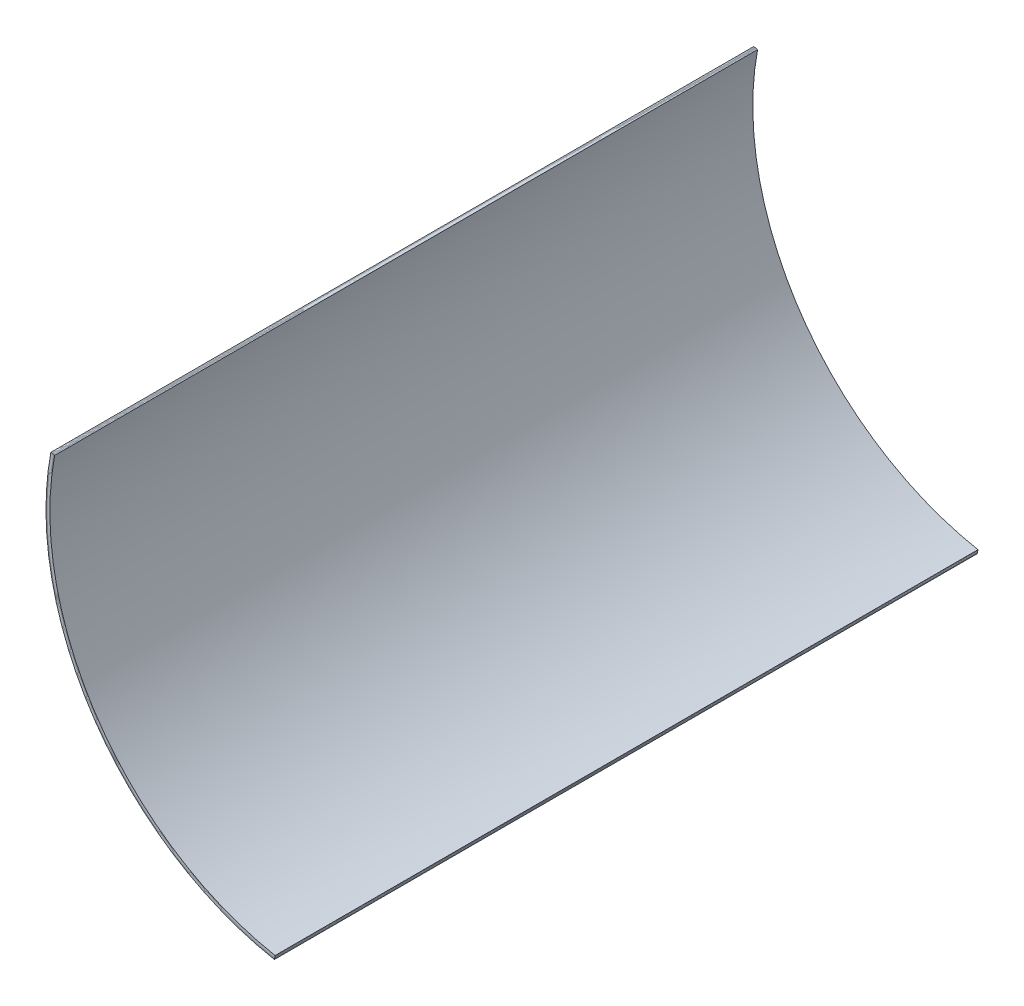
ISO-10303-21;
HEADER;
FILE_DESCRIPTION(('STEP AP214'),'2;1');
FILE_NAME('part.step','',(''),(''),'','','');
FILE_SCHEMA(('AUTOMOTIVE_DESIGN { 1 0 10303 214 1 1 1 1 }'));
ENDSEC;
DATA;
#1=APPLICATION_CONTEXT('core data for automotive mechanical design processes');
#2=APPLICATION_PROTOCOL_DEFINITION('international standard','automotive_design',2000,#1);
#3=PRODUCT_CONTEXT('',#1,'mechanical');
#4=PRODUCT('Part','Part','',(#3));
#5=PRODUCT_RELATED_PRODUCT_CATEGORY('part','',(#4));
#6=PRODUCT_DEFINITION_FORMATION('','',#4);
#7=PRODUCT_DEFINITION_CONTEXT('part definition',#1,'design');
#8=PRODUCT_DEFINITION('design','',#6,#7);
#9=PRODUCT_DEFINITION_SHAPE('','',#8);
#10=(LENGTH_UNIT() NAMED_UNIT(*) SI_UNIT(.MILLI.,.METRE.));
#11=(NAMED_UNIT(*) PLANE_ANGLE_UNIT() SI_UNIT($,.RADIAN.));
#12=(NAMED_UNIT(*) SI_UNIT($,.STERADIAN.) SOLID_ANGLE_UNIT());
#13=UNCERTAINTY_MEASURE_WITH_UNIT(LENGTH_MEASURE(1.E-05),#10,'distance_accuracy_value','');
#14=(GEOMETRIC_REPRESENTATION_CONTEXT(3) GLOBAL_UNCERTAINTY_ASSIGNED_CONTEXT((#13)) GLOBAL_UNIT_ASSIGNED_CONTEXT((#10,
#11,#12)) REPRESENTATION_CONTEXT('',''));
#15=CARTESIAN_POINT('',(0.,0.,0.));
#16=DIRECTION('',(0.,0.,1.));
#17=DIRECTION('',(1.,0.,0.));
#18=AXIS2_PLACEMENT_3D('',#15,#16,#17);
#19=CARTESIAN_POINT('',(0.,0.,607.06));
#20=DIRECTION('',(0.,0.,-1.));
#21=DIRECTION('',(-1.,0.,0.));
#22=AXIS2_PLACEMENT_3D('',#19,#20,#21);
#23=CYLINDRICAL_SURFACE('',#22,239.5728);
#24=CARTESIAN_POINT('',(0.,0.,0.));
#25=DIRECTION('',(0.,0.,1.));
#26=DIRECTION('',(1.,0.,0.));
#27=AXIS2_PLACEMENT_3D('',#24,#25,#26);
#28=CIRCLE('',#27,239.5728);
#29=CARTESIAN_POINT('',(-44.4186799700278,-235.419003841152,0.));
#30=VERTEX_POINT('',#29);
#31=CARTESIAN_POINT('',(-235.419003841152,44.4186799700286,0.));
#32=VERTEX_POINT('',#31);
#33=EDGE_CURVE('E130',#30,#32,#28,.F.);
#34=ORIENTED_EDGE('',*,*,#33,.T.);
#35=DIRECTION('',(0.,0.,-1.));
#36=VECTOR('',#35,1.);
#37=CARTESIAN_POINT('',(-235.419003841152,44.4186799700286,607.06));
#38=LINE('',#37,#36);
#39=CARTESIAN_POINT('',(-235.419003841152,44.4186799700286,607.06));
#40=VERTEX_POINT('',#39);
#41=EDGE_CURVE('E13',#40,#32,#38,.T.);
#42=ORIENTED_EDGE('',*,*,#41,.F.);
#43=CARTESIAN_POINT('',(0.,0.,607.06));
#44=DIRECTION('',(0.,0.,1.));
#45=DIRECTION('',(1.,0.,0.));
#46=AXIS2_PLACEMENT_3D('',#43,#44,#45);
#47=CIRCLE('',#46,239.5728);
#48=CARTESIAN_POINT('',(-44.4186799700278,-235.419003841152,607.06));
#49=VERTEX_POINT('',#48);
#50=EDGE_CURVE('E107',#49,#40,#47,.F.);
#51=ORIENTED_EDGE('',*,*,#50,.F.);
#52=DIRECTION('',(0.,0.,-1.));
#53=VECTOR('',#52,1.);
#54=CARTESIAN_POINT('',(-44.4186799700278,-235.419003841152,607.06));
#55=LINE('',#54,#53);
#56=EDGE_CURVE('E83',#49,#30,#55,.T.);
#57=ORIENTED_EDGE('',*,*,#56,.T.);
#58=EDGE_LOOP('',(#34,#42,#51,#57));
#59=FACE_BOUND('',#58,.T.);
#60=ADVANCED_FACE('F67',(#59),#23,.F.);
#61=CARTESIAN_POINT('',(-237.914964441673,44.8896159323911,607.06));
#62=DIRECTION('',(0.185407859197813,0.982661653748473,0.));
#63=DIRECTION('',(-0.982661653748473,0.185407859197813,0.));
#64=AXIS2_PLACEMENT_3D('',#61,#62,#63);
#65=PLANE('',#64);
#66=DIRECTION('',(0.982661653748473,-0.185407859197813,0.));
#67=VECTOR('',#66,1.);
#68=CARTESIAN_POINT('',(-237.914964441673,44.8896159323911,0.));
#69=LINE('',#68,#67);
#70=CARTESIAN_POINT('',(-237.914964441673,44.8896159323911,0.));
#71=VERTEX_POINT('',#70);
#72=EDGE_CURVE('E116',#71,#32,#69,.T.);
#73=ORIENTED_EDGE('',*,*,#72,.F.);
#74=DIRECTION('',(0.,0.,-1.));
#75=VECTOR('',#74,1.);
#76=CARTESIAN_POINT('',(-237.914964441673,44.8896159323911,607.06));
#77=LINE('',#76,#75);
#78=CARTESIAN_POINT('',(-237.914964441673,44.8896159323911,607.06));
#79=VERTEX_POINT('',#78);
#80=EDGE_CURVE('E75',#79,#71,#77,.T.);
#81=ORIENTED_EDGE('',*,*,#80,.F.);
#82=DIRECTION('',(0.982661653748473,-0.185407859197813,0.));
#83=VECTOR('',#82,1.);
#84=CARTESIAN_POINT('',(-237.914964441673,44.8896159323911,607.06));
#85=LINE('',#84,#83);
#86=EDGE_CURVE('E114',#79,#40,#85,.T.);
#87=ORIENTED_EDGE('',*,*,#86,.T.);
#88=ORIENTED_EDGE('',*,*,#41,.T.);
#89=EDGE_LOOP('',(#73,#81,#87,#88));
#90=FACE_BOUND('',#89,.T.);
#91=ADVANCED_FACE('F113',(#90),#65,.T.);
#92=CARTESIAN_POINT('',(0.,0.,607.06));
#93=DIRECTION('',(0.,0.,-1.));
#94=DIRECTION('',(-1.,0.,0.));
#95=AXIS2_PLACEMENT_3D('',#92,#93,#94);
#96=CYLINDRICAL_SURFACE('',#95,242.1128);
#97=CARTESIAN_POINT('',(0.,0.,0.));
#98=DIRECTION('',(0.,0.,-1.));
#99=DIRECTION('',(-1.,0.,0.));
#100=AXIS2_PLACEMENT_3D('',#97,#98,#99);
#101=CIRCLE('',#100,242.1128);
#102=CARTESIAN_POINT('',(-44.8896159323902,-237.914964441673,0.));
#103=VERTEX_POINT('',#102);
#104=EDGE_CURVE('E133',#103,#71,#101,.T.);
#105=ORIENTED_EDGE('',*,*,#104,.F.);
#106=DIRECTION('',(0.,0.,-1.));
#107=VECTOR('',#106,1.);
#108=CARTESIAN_POINT('',(-44.8896159323902,-237.914964441673,607.06));
#109=LINE('',#108,#107);
#110=CARTESIAN_POINT('',(-44.8896159323902,-237.914964441673,607.06));
#111=VERTEX_POINT('',#110);
#112=EDGE_CURVE('E96',#111,#103,#109,.T.);
#113=ORIENTED_EDGE('',*,*,#112,.F.);
#114=CARTESIAN_POINT('',(0.,0.,607.06));
#115=DIRECTION('',(0.,0.,-1.));
#116=DIRECTION('',(-1.,0.,0.));
#117=AXIS2_PLACEMENT_3D('',#114,#115,#116);
#118=CIRCLE('',#117,242.1128);
#119=EDGE_CURVE('E122',#111,#79,#118,.T.);
#120=ORIENTED_EDGE('',*,*,#119,.T.);
#121=ORIENTED_EDGE('',*,*,#80,.T.);
#122=EDGE_LOOP('',(#105,#113,#120,#121));
#123=FACE_BOUND('',#122,.T.);
#124=ADVANCED_FACE('F124',(#123),#96,.T.);
#125=CARTESIAN_POINT('',(-44.4186799700278,-235.419003841152,607.06));
#126=DIRECTION('',(0.982661653748478,-0.185407859197787,0.));
#127=DIRECTION('',(0.185407859197787,0.982661653748478,0.));
#128=AXIS2_PLACEMENT_3D('',#125,#126,#127);
#129=PLANE('',#128);
#130=DIRECTION('',(-0.185407859197787,-0.982661653748478,0.));
#131=VECTOR('',#130,1.);
#132=CARTESIAN_POINT('',(-44.4186799700278,-235.419003841152,0.));
#133=LINE('',#132,#131);
#134=EDGE_CURVE('E135',#30,#103,#133,.T.);
#135=ORIENTED_EDGE('',*,*,#134,.F.);
#136=ORIENTED_EDGE('',*,*,#56,.F.);
#137=DIRECTION('',(-0.185407859197787,-0.982661653748478,0.));
#138=VECTOR('',#137,1.);
#139=CARTESIAN_POINT('',(-44.4186799700278,-235.419003841152,607.06));
#140=LINE('',#139,#138);
#141=EDGE_CURVE('E125',#49,#111,#140,.T.);
#142=ORIENTED_EDGE('',*,*,#141,.T.);
#143=ORIENTED_EDGE('',*,*,#112,.T.);
#144=EDGE_LOOP('',(#135,#136,#142,#143));
#145=FACE_BOUND('',#144,.T.);
#146=ADVANCED_FACE('F141',(#145),#129,.T.);
#147=CARTESIAN_POINT('',(0.,0.,607.06));
#148=DIRECTION('',(0.,0.,1.));
#149=DIRECTION('',(1.,0.,0.));
#150=AXIS2_PLACEMENT_3D('',#147,#148,#149);
#151=PLANE('',#150);
#152=ORIENTED_EDGE('',*,*,#50,.T.);
#153=ORIENTED_EDGE('',*,*,#86,.F.);
#154=ORIENTED_EDGE('',*,*,#119,.F.);
#155=ORIENTED_EDGE('',*,*,#141,.F.);
#156=EDGE_LOOP('',(#152,#153,#154,#155));
#157=FACE_BOUND('',#156,.T.);
#158=ADVANCED_FACE('F121',(#157),#151,.T.);
#159=CARTESIAN_POINT('',(0.,0.,0.));
#160=DIRECTION('',(0.,0.,1.));
#161=DIRECTION('',(1.,0.,0.));
#162=AXIS2_PLACEMENT_3D('',#159,#160,#161);
#163=PLANE('',#162);
#164=ORIENTED_EDGE('',*,*,#33,.F.);
#165=ORIENTED_EDGE('',*,*,#134,.T.);
#166=ORIENTED_EDGE('',*,*,#104,.T.);
#167=ORIENTED_EDGE('',*,*,#72,.T.);
#168=EDGE_LOOP('',(#164,#165,#166,#167));
#169=FACE_BOUND('',#168,.T.);
#170=ADVANCED_FACE('F140',(#169),#163,.F.);
#171=CLOSED_SHELL('',(#60,#91,#124,#146,#158,#170));
#172=MANIFOLD_SOLID_BREP('B2',#171);
#173=CARTESIAN_POINT('',(0.,0.,607.06));
#174=DIRECTION('',(0.,0.,-1.));
#175=DIRECTION('',(-1.,0.,0.));
#176=AXIS2_PLACEMENT_3D('',#173,#174,#175);
#177=CYLINDRICAL_SURFACE('',#176,238.76);
#178=CARTESIAN_POINT('',(0.,0.,0.));
#179=DIRECTION('',(0.,0.,1.));
#180=DIRECTION('',(1.,0.,0.));
#181=AXIS2_PLACEMENT_3D('',#178,#179,#180);
#182=CIRCLE('',#181,238.76);
#183=CARTESIAN_POINT('',(-44.2679804620718,-234.620296448985,0.));
#184=VERTEX_POINT('',#183);
#185=CARTESIAN_POINT('',(-234.620296448985,44.2679804620727,0.));
#186=VERTEX_POINT('',#185);
#187=EDGE_CURVE('E254',#184,#186,#182,.F.);
#188=ORIENTED_EDGE('',*,*,#187,.T.);
#189=DIRECTION('',(0.,0.,-1.));
#190=VECTOR('',#189,1.);
#191=CARTESIAN_POINT('',(-234.620296448985,44.2679804620727,607.06));
#192=LINE('',#191,#190);
#193=CARTESIAN_POINT('',(-234.620296448985,44.2679804620727,607.06));
#194=VERTEX_POINT('',#193);
#195=EDGE_CURVE('E65',#194,#186,#192,.T.);
#196=ORIENTED_EDGE('',*,*,#195,.F.);
#197=CARTESIAN_POINT('',(0.,0.,607.06));
#198=DIRECTION('',(0.,0.,1.));
#199=DIRECTION('',(1.,0.,0.));
#200=AXIS2_PLACEMENT_3D('',#197,#198,#199);
#201=CIRCLE('',#200,238.76);
#202=CARTESIAN_POINT('',(-44.2679804620718,-234.620296448985,607.06));
#203=VERTEX_POINT('',#202);
#204=EDGE_CURVE('E231',#203,#194,#201,.F.);
#205=ORIENTED_EDGE('',*,*,#204,.F.);
#206=DIRECTION('',(0.,0.,-1.));
#207=VECTOR('',#206,1.);
#208=CARTESIAN_POINT('',(-44.2679804620718,-234.620296448985,607.06));
#209=LINE('',#208,#207);
#210=EDGE_CURVE('E207',#203,#184,#209,.T.);
#211=ORIENTED_EDGE('',*,*,#210,.T.);
#212=EDGE_LOOP('',(#188,#196,#205,#211));
#213=FACE_BOUND('',#212,.T.);
#214=ADVANCED_FACE('F191',(#213),#177,.F.);
#215=CARTESIAN_POINT('',(-237.116257049506,44.7389164244351,607.06));
#216=DIRECTION('',(0.185407859197813,0.982661653748473,0.));
#217=DIRECTION('',(-0.982661653748473,0.185407859197813,0.));
#218=AXIS2_PLACEMENT_3D('',#215,#216,#217);
#219=PLANE('',#218);
#220=DIRECTION('',(0.982661653748473,-0.185407859197813,0.));
#221=VECTOR('',#220,1.);
#222=CARTESIAN_POINT('',(-237.116257049506,44.7389164244351,0.));
#223=LINE('',#222,#221);
#224=CARTESIAN_POINT('',(-237.116257049506,44.7389164244351,0.));
#225=VERTEX_POINT('',#224);
#226=EDGE_CURVE('E240',#225,#186,#223,.T.);
#227=ORIENTED_EDGE('',*,*,#226,.F.);
#228=DIRECTION('',(0.,0.,-1.));
#229=VECTOR('',#228,1.);
#230=CARTESIAN_POINT('',(-237.116257049506,44.7389164244351,607.06));
#231=LINE('',#230,#229);
#232=CARTESIAN_POINT('',(-237.116257049506,44.7389164244351,607.06));
#233=VERTEX_POINT('',#232);
#234=EDGE_CURVE('E199',#233,#225,#231,.T.);
#235=ORIENTED_EDGE('',*,*,#234,.F.);
#236=DIRECTION('',(0.982661653748473,-0.185407859197813,0.));
#237=VECTOR('',#236,1.);
#238=CARTESIAN_POINT('',(-237.116257049506,44.7389164244351,607.06));
#239=LINE('',#238,#237);
#240=EDGE_CURVE('E238',#233,#194,#239,.T.);
#241=ORIENTED_EDGE('',*,*,#240,.T.);
#242=ORIENTED_EDGE('',*,*,#195,.T.);
#243=EDGE_LOOP('',(#227,#235,#241,#242));
#244=FACE_BOUND('',#243,.T.);
#245=ADVANCED_FACE('F237',(#244),#219,.T.);
#246=CARTESIAN_POINT('',(0.,0.,607.06));
#247=DIRECTION('',(0.,0.,-1.));
#248=DIRECTION('',(-1.,0.,0.));
#249=AXIS2_PLACEMENT_3D('',#246,#247,#248);
#250=CYLINDRICAL_SURFACE('',#249,241.3);
#251=CARTESIAN_POINT('',(0.,0.,0.));
#252=DIRECTION('',(0.,0.,-1.));
#253=DIRECTION('',(-1.,0.,0.));
#254=AXIS2_PLACEMENT_3D('',#251,#252,#253);
#255=CIRCLE('',#254,241.3);
#256=CARTESIAN_POINT('',(-44.7389164244342,-237.116257049506,0.));
#257=VERTEX_POINT('',#256);
#258=EDGE_CURVE('E257',#257,#225,#255,.T.);
#259=ORIENTED_EDGE('',*,*,#258,.F.);
#260=DIRECTION('',(0.,0.,-1.));
#261=VECTOR('',#260,1.);
#262=CARTESIAN_POINT('',(-44.7389164244342,-237.116257049506,607.06));
#263=LINE('',#262,#261);
#264=CARTESIAN_POINT('',(-44.7389164244342,-237.116257049506,607.06));
#265=VERTEX_POINT('',#264);
#266=EDGE_CURVE('E220',#265,#257,#263,.T.);
#267=ORIENTED_EDGE('',*,*,#266,.F.);
#268=CARTESIAN_POINT('',(0.,0.,607.06));
#269=DIRECTION('',(0.,0.,-1.));
#270=DIRECTION('',(-1.,0.,0.));
#271=AXIS2_PLACEMENT_3D('',#268,#269,#270);
#272=CIRCLE('',#271,241.3);
#273=EDGE_CURVE('E246',#265,#233,#272,.T.);
#274=ORIENTED_EDGE('',*,*,#273,.T.);
#275=ORIENTED_EDGE('',*,*,#234,.T.);
#276=EDGE_LOOP('',(#259,#267,#274,#275));
#277=FACE_BOUND('',#276,.T.);
#278=ADVANCED_FACE('F248',(#277),#250,.T.);
#279=CARTESIAN_POINT('',(-44.2679804620718,-234.620296448985,607.06));
#280=DIRECTION('',(0.982661653748478,-0.185407859197789,0.));
#281=DIRECTION('',(0.185407859197789,0.982661653748478,0.));
#282=AXIS2_PLACEMENT_3D('',#279,#280,#281);
#283=PLANE('',#282);
#284=DIRECTION('',(-0.185407859197789,-0.982661653748478,0.));
#285=VECTOR('',#284,1.);
#286=CARTESIAN_POINT('',(-44.2679804620718,-234.620296448985,0.));
#287=LINE('',#286,#285);
#288=EDGE_CURVE('E259',#184,#257,#287,.T.);
#289=ORIENTED_EDGE('',*,*,#288,.F.);
#290=ORIENTED_EDGE('',*,*,#210,.F.);
#291=DIRECTION('',(-0.185407859197789,-0.982661653748478,0.));
#292=VECTOR('',#291,1.);
#293=CARTESIAN_POINT('',(-44.2679804620718,-234.620296448985,607.06));
#294=LINE('',#293,#292);
#295=EDGE_CURVE('E249',#203,#265,#294,.T.);
#296=ORIENTED_EDGE('',*,*,#295,.T.);
#297=ORIENTED_EDGE('',*,*,#266,.T.);
#298=EDGE_LOOP('',(#289,#290,#296,#297));
#299=FACE_BOUND('',#298,.T.);
#300=ADVANCED_FACE('F265',(#299),#283,.T.);
#301=CARTESIAN_POINT('',(0.,0.,607.06));
#302=DIRECTION('',(0.,0.,1.));
#303=DIRECTION('',(1.,0.,0.));
#304=AXIS2_PLACEMENT_3D('',#301,#302,#303);
#305=PLANE('',#304);
#306=ORIENTED_EDGE('',*,*,#204,.T.);
#307=ORIENTED_EDGE('',*,*,#240,.F.);
#308=ORIENTED_EDGE('',*,*,#273,.F.);
#309=ORIENTED_EDGE('',*,*,#295,.F.);
#310=EDGE_LOOP('',(#306,#307,#308,#309));
#311=FACE_BOUND('',#310,.T.);
#312=ADVANCED_FACE('F245',(#311),#305,.T.);
#313=CARTESIAN_POINT('',(0.,0.,0.));
#314=DIRECTION('',(0.,0.,1.));
#315=DIRECTION('',(1.,0.,0.));
#316=AXIS2_PLACEMENT_3D('',#313,#314,#315);
#317=PLANE('',#316);
#318=ORIENTED_EDGE('',*,*,#187,.F.);
#319=ORIENTED_EDGE('',*,*,#288,.T.);
#320=ORIENTED_EDGE('',*,*,#258,.T.);
#321=ORIENTED_EDGE('',*,*,#226,.T.);
#322=EDGE_LOOP('',(#318,#319,#320,#321));
#323=FACE_BOUND('',#322,.T.);
#324=ADVANCED_FACE('F264',(#323),#317,.F.);
#325=CLOSED_SHELL('',(#214,#245,#278,#300,#312,#324));
#326=MANIFOLD_SOLID_BREP('B7',#325);
#327=ADVANCED_BREP_SHAPE_REPRESENTATION('',(#18,#172,#326),#14);
#328=SHAPE_DEFINITION_REPRESENTATION(#9,#327);
ENDSEC;
END-ISO-10303-21;
